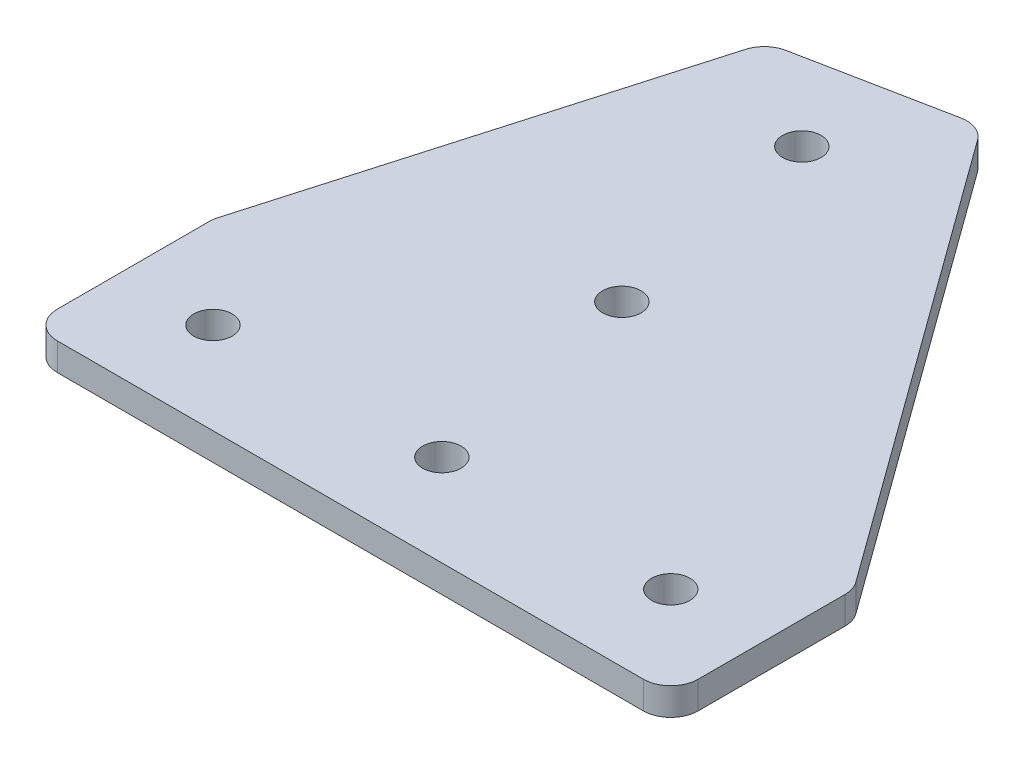
ISO-10303-21;
HEADER;
FILE_DESCRIPTION(('STEP AP214'),'2;1');
FILE_NAME('part.step','',(''),(''),'','','');
FILE_SCHEMA(('AUTOMOTIVE_DESIGN { 1 0 10303 214 1 1 1 1 }'));
ENDSEC;
DATA;
#1=APPLICATION_CONTEXT('core data for automotive mechanical design processes');
#2=APPLICATION_PROTOCOL_DEFINITION('international standard','automotive_design',2000,#1);
#3=PRODUCT_CONTEXT('',#1,'mechanical');
#4=PRODUCT('Part','Part','',(#3));
#5=PRODUCT_RELATED_PRODUCT_CATEGORY('part','',(#4));
#6=PRODUCT_DEFINITION_FORMATION('','',#4);
#7=PRODUCT_DEFINITION_CONTEXT('part definition',#1,'design');
#8=PRODUCT_DEFINITION('design','',#6,#7);
#9=PRODUCT_DEFINITION_SHAPE('','',#8);
#10=(LENGTH_UNIT() NAMED_UNIT(*) SI_UNIT(.MILLI.,.METRE.));
#11=(NAMED_UNIT(*) PLANE_ANGLE_UNIT() SI_UNIT($,.RADIAN.));
#12=(NAMED_UNIT(*) SI_UNIT($,.STERADIAN.) SOLID_ANGLE_UNIT());
#13=UNCERTAINTY_MEASURE_WITH_UNIT(LENGTH_MEASURE(1.E-05),#10,'distance_accuracy_value','');
#14=(GEOMETRIC_REPRESENTATION_CONTEXT(3) GLOBAL_UNCERTAINTY_ASSIGNED_CONTEXT((#13)) GLOBAL_UNIT_ASSIGNED_CONTEXT((#10,
#11,#12)) REPRESENTATION_CONTEXT('',''));
#15=CARTESIAN_POINT('',(0.,0.,0.));
#16=DIRECTION('',(0.,0.,1.));
#17=DIRECTION('',(1.,0.,0.));
#18=AXIS2_PLACEMENT_3D('',#15,#16,#17);
#19=CARTESIAN_POINT('',(-11.6746054395056,3.,-58.8532377005026));
#20=DIRECTION('',(0.194576757325094,0.,0.980887295008377));
#21=DIRECTION('',(0.980887295008377,0.,-0.194576757325094));
#22=AXIS2_PLACEMENT_3D('',#19,#20,#21);
#23=PLANE('',#22);
#24=DIRECTION('',(-0.980887295008377,0.,0.194576757325094));
#25=VECTOR('',#24,1.);
#26=CARTESIAN_POINT('',(-11.6746054395056,3.,-58.8532377005026));
#27=LINE('',#26,#25);
#28=CARTESIAN_POINT('',(-3.74948719123686,3.,-60.4253284167484));
#29=VERTEX_POINT('',#28);
#30=CARTESIAN_POINT('',(-19.6905986844829,3.,-57.2631202830533));
#31=VERTEX_POINT('',#30);
#32=EDGE_CURVE('E150',#29,#31,#27,.T.);
#33=ORIENTED_EDGE('',*,*,#32,.F.);
#34=DIRECTION('',(0.,-1.,0.));
#35=VECTOR('',#34,1.);
#36=CARTESIAN_POINT('',(-3.74948719123686,0.,-60.4253284167484));
#37=LINE('',#36,#35);
#38=CARTESIAN_POINT('',(-3.74948719123686,0.,-60.4253284167484));
#39=VERTEX_POINT('',#38);
#40=EDGE_CURVE('E135',#29,#39,#37,.T.);
#41=ORIENTED_EDGE('',*,*,#40,.T.);
#42=DIRECTION('',(-0.980887295008377,0.,0.194576757325094));
#43=VECTOR('',#42,1.);
#44=CARTESIAN_POINT('',(-11.6746054395056,0.,-58.8532377005026));
#45=LINE('',#44,#43);
#46=CARTESIAN_POINT('',(-19.6905986844829,0.,-57.2631202830533));
#47=VERTEX_POINT('',#46);
#48=EDGE_CURVE('E147',#39,#47,#45,.T.);
#49=ORIENTED_EDGE('',*,*,#48,.T.);
#50=DIRECTION('',(0.,-1.,0.));
#51=VECTOR('',#50,1.);
#52=CARTESIAN_POINT('',(-19.6905986844829,3.,-57.2631202830533));
#53=LINE('',#52,#51);
#54=EDGE_CURVE('E152',#47,#31,#53,.F.);
#55=ORIENTED_EDGE('',*,*,#54,.T.);
#56=EDGE_LOOP('',(#33,#41,#49,#55));
#57=FACE_BOUND('',#56,.T.);
#58=ADVANCED_FACE('F41',(#57),#23,.F.);
#59=CARTESIAN_POINT('',(-34.9772916586416,3.,-10.0788065801698));
#60=DIRECTION('',(0.960902540461166,0.,0.276886813942587));
#61=DIRECTION('',(0.276886813942587,0.,-0.960902540461166));
#62=AXIS2_PLACEMENT_3D('',#59,#60,#61);
#63=PLANE('',#62);
#64=DIRECTION('',(-0.276886813942587,0.,0.960902540461166));
#65=VECTOR('',#64,1.);
#66=CARTESIAN_POINT('',(-34.9772916586416,0.,-10.0788065801698));
#67=LINE('',#66,#65);
#68=CARTESIAN_POINT('',(-21.9895760338912,0.,-55.151118839856));
#69=VERTEX_POINT('',#68);
#70=CARTESIAN_POINT('',(-34.8827076213835,0.,-10.407049158407));
#71=VERTEX_POINT('',#70);
#72=EDGE_CURVE('E158',#69,#71,#67,.T.);
#73=ORIENTED_EDGE('',*,*,#72,.T.);
#74=DIRECTION('',(0.,-1.,0.));
#75=VECTOR('',#74,1.);
#76=CARTESIAN_POINT('',(-34.8827076213835,3.,-10.407049158407));
#77=LINE('',#76,#75);
#78=CARTESIAN_POINT('',(-34.8827076213835,3.,-10.407049158407));
#79=VERTEX_POINT('',#78);
#80=EDGE_CURVE('E11',#71,#79,#77,.F.);
#81=ORIENTED_EDGE('',*,*,#80,.T.);
#82=DIRECTION('',(-0.276886813942587,0.,0.960902540461166));
#83=VECTOR('',#82,1.);
#84=CARTESIAN_POINT('',(-34.9772916586416,3.,-10.0788065801698));
#85=LINE('',#84,#83);
#86=CARTESIAN_POINT('',(-21.9895760338912,3.,-55.151118839856));
#87=VERTEX_POINT('',#86);
#88=EDGE_CURVE('E234',#87,#79,#85,.T.);
#89=ORIENTED_EDGE('',*,*,#88,.F.);
#90=DIRECTION('',(0.,-1.,0.));
#91=VECTOR('',#90,1.);
#92=CARTESIAN_POINT('',(-21.9895760338912,3.,-55.151118839856));
#93=LINE('',#92,#91);
#94=EDGE_CURVE('E49',#87,#69,#93,.T.);
#95=ORIENTED_EDGE('',*,*,#94,.T.);
#96=EDGE_LOOP('',(#73,#81,#89,#95));
#97=FACE_BOUND('',#96,.T.);
#98=ADVANCED_FACE('F231',(#97),#63,.F.);
#99=CARTESIAN_POINT('',(-35.,3.,0.));
#100=DIRECTION('',(1.,0.,0.));
#101=DIRECTION('',(0.,0.,-1.));
#102=AXIS2_PLACEMENT_3D('',#99,#100,#101);
#103=PLANE('',#102);
#104=DIRECTION('',(0.,0.,1.));
#105=VECTOR('',#104,1.);
#106=CARTESIAN_POINT('',(-35.,0.,0.));
#107=LINE('',#106,#105);
#108=CARTESIAN_POINT('',(-35.,0.,-9.57638871657927));
#109=VERTEX_POINT('',#108);
#110=CARTESIAN_POINT('',(-35.,0.,7.));
#111=VERTEX_POINT('',#110);
#112=EDGE_CURVE('E161',#109,#111,#107,.T.);
#113=ORIENTED_EDGE('',*,*,#112,.T.);
#114=DIRECTION('',(0.,-1.,0.));
#115=VECTOR('',#114,1.);
#116=CARTESIAN_POINT('',(-35.,3.,7.));
#117=LINE('',#116,#115);
#118=CARTESIAN_POINT('',(-35.,3.,7.));
#119=VERTEX_POINT('',#118);
#120=EDGE_CURVE('E226',#111,#119,#117,.F.);
#121=ORIENTED_EDGE('',*,*,#120,.T.);
#122=DIRECTION('',(0.,0.,1.));
#123=VECTOR('',#122,1.);
#124=CARTESIAN_POINT('',(-35.,3.,0.));
#125=LINE('',#124,#123);
#126=CARTESIAN_POINT('',(-35.,3.,-9.57638871657927));
#127=VERTEX_POINT('',#126);
#128=EDGE_CURVE('E247',#127,#119,#125,.T.);
#129=ORIENTED_EDGE('',*,*,#128,.F.);
#130=DIRECTION('',(0.,-1.,0.));
#131=VECTOR('',#130,1.);
#132=CARTESIAN_POINT('',(-35.,3.,-9.57638871657927));
#133=LINE('',#132,#131);
#134=EDGE_CURVE('E223',#127,#109,#133,.T.);
#135=ORIENTED_EDGE('',*,*,#134,.T.);
#136=EDGE_LOOP('',(#113,#121,#129,#135));
#137=FACE_BOUND('',#136,.T.);
#138=ADVANCED_FACE('F244',(#137),#103,.F.);
#139=CARTESIAN_POINT('',(0.,3.,10.));
#140=DIRECTION('',(0.,0.,-1.));
#141=DIRECTION('',(-1.,0.,0.));
#142=AXIS2_PLACEMENT_3D('',#139,#140,#141);
#143=PLANE('',#142);
#144=DIRECTION('',(1.,0.,0.));
#145=VECTOR('',#144,1.);
#146=CARTESIAN_POINT('',(0.,3.,10.));
#147=LINE('',#146,#145);
#148=CARTESIAN_POINT('',(-32.,3.,10.));
#149=VERTEX_POINT('',#148);
#150=CARTESIAN_POINT('',(32.,3.,10.));
#151=VERTEX_POINT('',#150);
#152=EDGE_CURVE('E249',#149,#151,#147,.T.);
#153=ORIENTED_EDGE('',*,*,#152,.F.);
#154=DIRECTION('',(0.,-1.,0.));
#155=VECTOR('',#154,1.);
#156=CARTESIAN_POINT('',(-32.,3.,10.));
#157=LINE('',#156,#155);
#158=CARTESIAN_POINT('',(-32.,0.,10.));
#159=VERTEX_POINT('',#158);
#160=EDGE_CURVE('E220',#149,#159,#157,.T.);
#161=ORIENTED_EDGE('',*,*,#160,.T.);
#162=DIRECTION('',(1.,0.,0.));
#163=VECTOR('',#162,1.);
#164=CARTESIAN_POINT('',(0.,0.,10.));
#165=LINE('',#164,#163);
#166=CARTESIAN_POINT('',(32.,0.,10.));
#167=VERTEX_POINT('',#166);
#168=EDGE_CURVE('E169',#159,#167,#165,.T.);
#169=ORIENTED_EDGE('',*,*,#168,.T.);
#170=DIRECTION('',(0.,-1.,0.));
#171=VECTOR('',#170,1.);
#172=CARTESIAN_POINT('',(32.,3.,10.));
#173=LINE('',#172,#171);
#174=EDGE_CURVE('E218',#167,#151,#173,.F.);
#175=ORIENTED_EDGE('',*,*,#174,.T.);
#176=EDGE_LOOP('',(#153,#161,#169,#175));
#177=FACE_BOUND('',#176,.T.);
#178=ADVANCED_FACE('F325',(#177),#143,.F.);
#179=CARTESIAN_POINT('',(35.,3.,0.));
#180=DIRECTION('',(1.,0.,0.));
#181=DIRECTION('',(0.,0.,-1.));
#182=AXIS2_PLACEMENT_3D('',#179,#180,#181);
#183=PLANE('',#182);
#184=DIRECTION('',(0.,0.,1.));
#185=VECTOR('',#184,1.);
#186=CARTESIAN_POINT('',(35.,0.,0.));
#187=LINE('',#186,#185);
#188=CARTESIAN_POINT('',(35.,0.,-9.02613656287791));
#189=VERTEX_POINT('',#188);
#190=CARTESIAN_POINT('',(35.,0.,7.));
#191=VERTEX_POINT('',#190);
#192=EDGE_CURVE('E172',#189,#191,#187,.T.);
#193=ORIENTED_EDGE('',*,*,#192,.F.);
#194=DIRECTION('',(0.,-1.,0.));
#195=VECTOR('',#194,1.);
#196=CARTESIAN_POINT('',(35.,3.,-9.02613656287791));
#197=LINE('',#196,#195);
#198=CARTESIAN_POINT('',(35.,3.,-9.02613656287791));
#199=VERTEX_POINT('',#198);
#200=EDGE_CURVE('E63',#189,#199,#197,.F.);
#201=ORIENTED_EDGE('',*,*,#200,.T.);
#202=DIRECTION('',(0.,0.,1.));
#203=VECTOR('',#202,1.);
#204=CARTESIAN_POINT('',(35.,3.,0.));
#205=LINE('',#204,#203);
#206=CARTESIAN_POINT('',(35.,3.,7.));
#207=VERTEX_POINT('',#206);
#208=EDGE_CURVE('E251',#199,#207,#205,.T.);
#209=ORIENTED_EDGE('',*,*,#208,.T.);
#210=DIRECTION('',(0.,-1.,0.));
#211=VECTOR('',#210,1.);
#212=CARTESIAN_POINT('',(35.,0.,7.));
#213=LINE('',#212,#211);
#214=EDGE_CURVE('E214',#207,#191,#213,.T.);
#215=ORIENTED_EDGE('',*,*,#214,.T.);
#216=EDGE_LOOP('',(#193,#201,#209,#215));
#217=FACE_BOUND('',#216,.T.);
#218=ADVANCED_FACE('F319',(#217),#183,.T.);
#219=CARTESIAN_POINT('',(-9.7288378662547,3.,-49.0443647504189));
#220=DIRECTION('',(0.,-1.,0.));
#221=DIRECTION('',(0.,0.,-1.));
#222=AXIS2_PLACEMENT_3D('',#219,#220,#221);
#223=CYLINDRICAL_SURFACE('',#222,2.1);
#224=CARTESIAN_POINT('',(-9.7288378662547,3.,-49.0443647504189));
#225=DIRECTION('',(0.,1.,0.));
#226=DIRECTION('',(0.,0.,1.));
#227=AXIS2_PLACEMENT_3D('',#224,#225,#226);
#228=CIRCLE('',#227,2.1);
#229=CARTESIAN_POINT('',(-9.7288378662547,3.,-46.9443647504189));
#230=VERTEX_POINT('',#229);
#231=EDGE_CURVE('E268',#230,#230,#228,.T.);
#232=ORIENTED_EDGE('',*,*,#231,.T.);
#233=EDGE_LOOP('',(#232));
#234=FACE_BOUND('',#233,.T.);
#235=CARTESIAN_POINT('',(-9.7288378662547,0.,-49.0443647504189));
#236=DIRECTION('',(0.,1.,0.));
#237=DIRECTION('',(0.,0.,1.));
#238=AXIS2_PLACEMENT_3D('',#235,#236,#237);
#239=CIRCLE('',#238,2.1);
#240=CARTESIAN_POINT('',(-9.7288378662547,0.,-46.9443647504189));
#241=VERTEX_POINT('',#240);
#242=EDGE_CURVE('E186',#241,#241,#239,.T.);
#243=ORIENTED_EDGE('',*,*,#242,.F.);
#244=EDGE_LOOP('',(#243));
#245=FACE_BOUND('',#244,.T.);
#246=ADVANCED_FACE('F333',(#234,#245),#223,.F.);
#247=CARTESIAN_POINT('',(0.,3.,0.));
#248=DIRECTION('',(0.,-1.,0.));
#249=DIRECTION('',(0.,0.,-1.));
#250=AXIS2_PLACEMENT_3D('',#247,#248,#249);
#251=CYLINDRICAL_SURFACE('',#250,2.1);
#252=CARTESIAN_POINT('',(0.,3.,0.));
#253=DIRECTION('',(0.,1.,0.));
#254=DIRECTION('',(0.,0.,1.));
#255=AXIS2_PLACEMENT_3D('',#252,#253,#254);
#256=CIRCLE('',#255,2.1);
#257=CARTESIAN_POINT('',(0.,3.,2.1));
#258=VERTEX_POINT('',#257);
#259=EDGE_CURVE('E266',#258,#258,#256,.T.);
#260=ORIENTED_EDGE('',*,*,#259,.T.);
#261=EDGE_LOOP('',(#260));
#262=FACE_BOUND('',#261,.T.);
#263=CARTESIAN_POINT('',(0.,0.,0.));
#264=DIRECTION('',(0.,1.,0.));
#265=DIRECTION('',(0.,0.,1.));
#266=AXIS2_PLACEMENT_3D('',#263,#264,#265);
#267=CIRCLE('',#266,2.1);
#268=CARTESIAN_POINT('',(0.,0.,2.1));
#269=VERTEX_POINT('',#268);
#270=EDGE_CURVE('E183',#269,#269,#267,.T.);
#271=ORIENTED_EDGE('',*,*,#270,.F.);
#272=EDGE_LOOP('',(#271));
#273=FACE_BOUND('',#272,.T.);
#274=ADVANCED_FACE('F344',(#262,#273),#251,.F.);
#275=CARTESIAN_POINT('',(25.,3.,0.));
#276=DIRECTION('',(0.,-1.,0.));
#277=DIRECTION('',(0.,0.,-1.));
#278=AXIS2_PLACEMENT_3D('',#275,#276,#277);
#279=CYLINDRICAL_SURFACE('',#278,2.1);
#280=CARTESIAN_POINT('',(25.,3.,0.));
#281=DIRECTION('',(0.,1.,0.));
#282=DIRECTION('',(0.,0.,1.));
#283=AXIS2_PLACEMENT_3D('',#280,#281,#282);
#284=CIRCLE('',#283,2.1);
#285=CARTESIAN_POINT('',(25.,3.,2.1));
#286=VERTEX_POINT('',#285);
#287=EDGE_CURVE('E263',#286,#286,#284,.T.);
#288=ORIENTED_EDGE('',*,*,#287,.T.);
#289=EDGE_LOOP('',(#288));
#290=FACE_BOUND('',#289,.T.);
#291=CARTESIAN_POINT('',(25.,0.,0.));
#292=DIRECTION('',(0.,1.,0.));
#293=DIRECTION('',(0.,0.,1.));
#294=AXIS2_PLACEMENT_3D('',#291,#292,#293);
#295=CIRCLE('',#294,2.1);
#296=CARTESIAN_POINT('',(25.,0.,2.1));
#297=VERTEX_POINT('',#296);
#298=EDGE_CURVE('E180',#297,#297,#295,.T.);
#299=ORIENTED_EDGE('',*,*,#298,.F.);
#300=EDGE_LOOP('',(#299));
#301=FACE_BOUND('',#300,.T.);
#302=ADVANCED_FACE('F340',(#290,#301),#279,.F.);
#303=CARTESIAN_POINT('',(-25.,3.,0.));
#304=DIRECTION('',(0.,-1.,0.));
#305=DIRECTION('',(0.,0.,-1.));
#306=AXIS2_PLACEMENT_3D('',#303,#304,#305);
#307=CYLINDRICAL_SURFACE('',#306,2.1);
#308=CARTESIAN_POINT('',(-25.,3.,0.));
#309=DIRECTION('',(0.,1.,0.));
#310=DIRECTION('',(0.,0.,1.));
#311=AXIS2_PLACEMENT_3D('',#308,#309,#310);
#312=CIRCLE('',#311,2.1);
#313=CARTESIAN_POINT('',(-25.,3.,2.1));
#314=VERTEX_POINT('',#313);
#315=EDGE_CURVE('E260',#314,#314,#312,.T.);
#316=ORIENTED_EDGE('',*,*,#315,.T.);
#317=EDGE_LOOP('',(#316));
#318=FACE_BOUND('',#317,.T.);
#319=CARTESIAN_POINT('',(-25.,0.,0.));
#320=DIRECTION('',(0.,1.,0.));
#321=DIRECTION('',(0.,0.,1.));
#322=AXIS2_PLACEMENT_3D('',#319,#320,#321);
#323=CIRCLE('',#322,2.1);
#324=CARTESIAN_POINT('',(-25.,0.,2.1));
#325=VERTEX_POINT('',#324);
#326=EDGE_CURVE('E177',#325,#325,#323,.T.);
#327=ORIENTED_EDGE('',*,*,#326,.F.);
#328=EDGE_LOOP('',(#327));
#329=FACE_BOUND('',#328,.T.);
#330=ADVANCED_FACE('F337',(#318,#329),#307,.F.);
#331=CARTESIAN_POINT('',(27.6793842625367,3.,-20.0874164798225));
#332=DIRECTION('',(0.80933435700385,0.,-0.587348191938278));
#333=DIRECTION('',(-0.587348191938278,0.,-0.80933435700385));
#334=AXIS2_PLACEMENT_3D('',#331,#332,#333);
#335=PLANE('',#334);
#336=DIRECTION('',(0.587348191938278,0.,0.80933435700385));
#337=VECTOR('',#336,1.);
#338=CARTESIAN_POINT('',(27.6793842625367,0.,-20.0874164798225));
#339=LINE('',#338,#337);
#340=CARTESIAN_POINT('',(-0.73775384825003,0.,-59.2447111075381));
#341=VERTEX_POINT('',#340);
#342=CARTESIAN_POINT('',(34.4280030710116,0.,-10.7881811386927));
#343=VERTEX_POINT('',#342);
#344=EDGE_CURVE('E175',#341,#343,#339,.T.);
#345=ORIENTED_EDGE('',*,*,#344,.F.);
#346=DIRECTION('',(0.,-1.,0.));
#347=VECTOR('',#346,1.);
#348=CARTESIAN_POINT('',(-0.737753848250034,3.,-59.2447111075381));
#349=LINE('',#348,#347);
#350=CARTESIAN_POINT('',(-0.73775384825003,3.,-59.2447111075381));
#351=VERTEX_POINT('',#350);
#352=EDGE_CURVE('E136',#341,#351,#349,.F.);
#353=ORIENTED_EDGE('',*,*,#352,.T.);
#354=DIRECTION('',(0.587348191938278,0.,0.80933435700385));
#355=VECTOR('',#354,1.);
#356=CARTESIAN_POINT('',(27.6793842625367,3.,-20.0874164798225));
#357=LINE('',#356,#355);
#358=CARTESIAN_POINT('',(34.4280030710116,3.,-10.7881811386927));
#359=VERTEX_POINT('',#358);
#360=EDGE_CURVE('E257',#351,#359,#357,.T.);
#361=ORIENTED_EDGE('',*,*,#360,.T.);
#362=DIRECTION('',(0.,-1.,0.));
#363=VECTOR('',#362,1.);
#364=CARTESIAN_POINT('',(34.4280030710116,3.,-10.7881811386927));
#365=LINE('',#364,#363);
#366=EDGE_CURVE('E141',#359,#343,#365,.T.);
#367=ORIENTED_EDGE('',*,*,#366,.T.);
#368=EDGE_LOOP('',(#345,#353,#361,#367));
#369=FACE_BOUND('',#368,.T.);
#370=ADVANCED_FACE('F287',(#369),#335,.T.);
#371=CARTESIAN_POINT('',(-4.86441893312735,3.,-24.5221823752094));
#372=DIRECTION('',(0.,-1.,0.));
#373=DIRECTION('',(0.,0.,-1.));
#374=AXIS2_PLACEMENT_3D('',#371,#372,#373);
#375=CYLINDRICAL_SURFACE('',#374,2.1);
#376=CARTESIAN_POINT('',(-4.86441893312735,3.,-24.5221823752094));
#377=DIRECTION('',(0.,1.,0.));
#378=DIRECTION('',(0.,0.,1.));
#379=AXIS2_PLACEMENT_3D('',#376,#377,#378);
#380=CIRCLE('',#379,2.1);
#381=CARTESIAN_POINT('',(-4.86441893312735,3.,-22.4221823752094));
#382=VERTEX_POINT('',#381);
#383=EDGE_CURVE('E164',#382,#382,#380,.T.);
#384=ORIENTED_EDGE('',*,*,#383,.T.);
#385=EDGE_LOOP('',(#384));
#386=FACE_BOUND('',#385,.T.);
#387=CARTESIAN_POINT('',(-4.86441893312735,0.,-24.5221823752094));
#388=DIRECTION('',(0.,1.,0.));
#389=DIRECTION('',(0.,0.,1.));
#390=AXIS2_PLACEMENT_3D('',#387,#388,#389);
#391=CIRCLE('',#390,2.1);
#392=CARTESIAN_POINT('',(-4.86441893312735,0.,-22.4221823752094));
#393=VERTEX_POINT('',#392);
#394=EDGE_CURVE('E189',#393,#393,#391,.T.);
#395=ORIENTED_EDGE('',*,*,#394,.F.);
#396=EDGE_LOOP('',(#395));
#397=FACE_BOUND('',#396,.T.);
#398=ADVANCED_FACE('F275',(#386,#397),#375,.F.);
#399=CARTESIAN_POINT('',(0.,3.,0.));
#400=DIRECTION('',(0.,1.,0.));
#401=DIRECTION('',(0.,0.,1.));
#402=AXIS2_PLACEMENT_3D('',#399,#400,#401);
#403=PLANE('',#402);
#404=ORIENTED_EDGE('',*,*,#360,.F.);
#405=CARTESIAN_POINT('',(-3.16575691926158,3.,-57.4826665317232));
#406=DIRECTION('',(0.,1.,0.));
#407=DIRECTION('',(0.,0.,1.));
#408=AXIS2_PLACEMENT_3D('',#405,#406,#407);
#409=CIRCLE('',#408,3.);
#410=EDGE_CURVE('E212',#351,#29,#409,.T.);
#411=ORIENTED_EDGE('',*,*,#410,.T.);
#412=ORIENTED_EDGE('',*,*,#32,.T.);
#413=CARTESIAN_POINT('',(-19.1068684125077,3.,-54.3204583980282));
#414=DIRECTION('',(0.,1.,0.));
#415=DIRECTION('',(0.,0.,1.));
#416=AXIS2_PLACEMENT_3D('',#413,#414,#415);
#417=CIRCLE('',#416,3.);
#418=EDGE_CURVE('E204',#31,#87,#417,.T.);
#419=ORIENTED_EDGE('',*,*,#418,.T.);
#420=ORIENTED_EDGE('',*,*,#88,.T.);
#421=CARTESIAN_POINT('',(-32.,3.,-9.57638871657927));
#422=DIRECTION('',(0.,1.,0.));
#423=DIRECTION('',(0.,0.,1.));
#424=AXIS2_PLACEMENT_3D('',#421,#422,#423);
#425=CIRCLE('',#424,3.);
#426=EDGE_CURVE('E206',#79,#127,#425,.T.);
#427=ORIENTED_EDGE('',*,*,#426,.T.);
#428=ORIENTED_EDGE('',*,*,#128,.T.);
#429=CARTESIAN_POINT('',(-32.,3.,7.));
#430=DIRECTION('',(0.,1.,0.));
#431=DIRECTION('',(0.,0.,1.));
#432=AXIS2_PLACEMENT_3D('',#429,#430,#431);
#433=CIRCLE('',#432,3.);
#434=EDGE_CURVE('E208',#119,#149,#433,.T.);
#435=ORIENTED_EDGE('',*,*,#434,.T.);
#436=ORIENTED_EDGE('',*,*,#152,.T.);
#437=CARTESIAN_POINT('',(32.,3.,7.));
#438=DIRECTION('',(0.,1.,0.));
#439=DIRECTION('',(0.,0.,1.));
#440=AXIS2_PLACEMENT_3D('',#437,#438,#439);
#441=CIRCLE('',#440,3.);
#442=EDGE_CURVE('E56',#151,#207,#441,.T.);
#443=ORIENTED_EDGE('',*,*,#442,.T.);
#444=ORIENTED_EDGE('',*,*,#208,.F.);
#445=CARTESIAN_POINT('',(32.,3.,-9.02613656287791));
#446=DIRECTION('',(0.,1.,0.));
#447=DIRECTION('',(0.,0.,1.));
#448=AXIS2_PLACEMENT_3D('',#445,#446,#447);
#449=CIRCLE('',#448,3.);
#450=EDGE_CURVE('E210',#199,#359,#449,.T.);
#451=ORIENTED_EDGE('',*,*,#450,.T.);
#452=EDGE_LOOP('',(#404,#411,#412,#419,#420,#427,#428,#435,#436,#443,#444,#451));
#453=FACE_BOUND('',#452,.T.);
#454=ORIENTED_EDGE('',*,*,#315,.F.);
#455=EDGE_LOOP('',(#454));
#456=FACE_BOUND('',#455,.T.);
#457=ORIENTED_EDGE('',*,*,#287,.F.);
#458=EDGE_LOOP('',(#457));
#459=FACE_BOUND('',#458,.T.);
#460=ORIENTED_EDGE('',*,*,#259,.F.);
#461=EDGE_LOOP('',(#460));
#462=FACE_BOUND('',#461,.T.);
#463=ORIENTED_EDGE('',*,*,#231,.F.);
#464=EDGE_LOOP('',(#463));
#465=FACE_BOUND('',#464,.T.);
#466=ORIENTED_EDGE('',*,*,#383,.F.);
#467=EDGE_LOOP('',(#466));
#468=FACE_BOUND('',#467,.T.);
#469=ADVANCED_FACE('F278',(#453,#456,#459,#462,#465,#468),#403,.T.);
#470=CARTESIAN_POINT('',(0.,0.,0.));
#471=DIRECTION('',(0.,1.,0.));
#472=DIRECTION('',(0.,0.,1.));
#473=AXIS2_PLACEMENT_3D('',#470,#471,#472);
#474=PLANE('',#473);
#475=ORIENTED_EDGE('',*,*,#48,.F.);
#476=CARTESIAN_POINT('',(-3.16575691926158,0.,-57.4826665317232));
#477=DIRECTION('',(0.,1.,0.));
#478=DIRECTION('',(0.,0.,1.));
#479=AXIS2_PLACEMENT_3D('',#476,#477,#478);
#480=CIRCLE('',#479,3.);
#481=EDGE_CURVE('E131',#39,#341,#480,.F.);
#482=ORIENTED_EDGE('',*,*,#481,.T.);
#483=ORIENTED_EDGE('',*,*,#344,.T.);
#484=CARTESIAN_POINT('',(32.,0.,-9.02613656287791));
#485=DIRECTION('',(0.,1.,0.));
#486=DIRECTION('',(0.,0.,1.));
#487=AXIS2_PLACEMENT_3D('',#484,#485,#486);
#488=CIRCLE('',#487,3.);
#489=EDGE_CURVE('E142',#343,#189,#488,.F.);
#490=ORIENTED_EDGE('',*,*,#489,.T.);
#491=ORIENTED_EDGE('',*,*,#192,.T.);
#492=CARTESIAN_POINT('',(32.,0.,7.));
#493=DIRECTION('',(0.,1.,0.));
#494=DIRECTION('',(0.,0.,1.));
#495=AXIS2_PLACEMENT_3D('',#492,#493,#494);
#496=CIRCLE('',#495,3.);
#497=EDGE_CURVE('E151',#191,#167,#496,.F.);
#498=ORIENTED_EDGE('',*,*,#497,.T.);
#499=ORIENTED_EDGE('',*,*,#168,.F.);
#500=CARTESIAN_POINT('',(-32.,0.,7.));
#501=DIRECTION('',(0.,1.,0.));
#502=DIRECTION('',(0.,0.,1.));
#503=AXIS2_PLACEMENT_3D('',#500,#501,#502);
#504=CIRCLE('',#503,3.);
#505=EDGE_CURVE('E197',#159,#111,#504,.F.);
#506=ORIENTED_EDGE('',*,*,#505,.T.);
#507=ORIENTED_EDGE('',*,*,#112,.F.);
#508=CARTESIAN_POINT('',(-32.,0.,-9.57638871657927));
#509=DIRECTION('',(0.,1.,0.));
#510=DIRECTION('',(0.,0.,1.));
#511=AXIS2_PLACEMENT_3D('',#508,#509,#510);
#512=CIRCLE('',#511,3.);
#513=EDGE_CURVE('E195',#109,#71,#512,.F.);
#514=ORIENTED_EDGE('',*,*,#513,.T.);
#515=ORIENTED_EDGE('',*,*,#72,.F.);
#516=CARTESIAN_POINT('',(-19.1068684125077,0.,-54.3204583980282));
#517=DIRECTION('',(0.,1.,0.));
#518=DIRECTION('',(0.,0.,1.));
#519=AXIS2_PLACEMENT_3D('',#516,#517,#518);
#520=CIRCLE('',#519,3.);
#521=EDGE_CURVE('E157',#69,#47,#520,.F.);
#522=ORIENTED_EDGE('',*,*,#521,.T.);
#523=EDGE_LOOP('',(#475,#482,#483,#490,#491,#498,#499,#506,#507,#514,#515,#522));
#524=FACE_BOUND('',#523,.T.);
#525=ORIENTED_EDGE('',*,*,#326,.T.);
#526=EDGE_LOOP('',(#525));
#527=FACE_BOUND('',#526,.T.);
#528=ORIENTED_EDGE('',*,*,#298,.T.);
#529=EDGE_LOOP('',(#528));
#530=FACE_BOUND('',#529,.T.);
#531=ORIENTED_EDGE('',*,*,#270,.T.);
#532=EDGE_LOOP('',(#531));
#533=FACE_BOUND('',#532,.T.);
#534=ORIENTED_EDGE('',*,*,#242,.T.);
#535=EDGE_LOOP('',(#534));
#536=FACE_BOUND('',#535,.T.);
#537=ORIENTED_EDGE('',*,*,#394,.T.);
#538=EDGE_LOOP('',(#537));
#539=FACE_BOUND('',#538,.T.);
#540=ADVANCED_FACE('F154',(#524,#527,#530,#533,#536,#539),#474,.F.);
#541=CARTESIAN_POINT('',(-3.16575691926158,3.,-57.4826665317232));
#542=DIRECTION('',(0.,1.,0.));
#543=DIRECTION('',(0.,0.,1.));
#544=AXIS2_PLACEMENT_3D('',#541,#542,#543);
#545=CYLINDRICAL_SURFACE('',#544,3.);
#546=ORIENTED_EDGE('',*,*,#410,.F.);
#547=ORIENTED_EDGE('',*,*,#352,.F.);
#548=ORIENTED_EDGE('',*,*,#481,.F.);
#549=ORIENTED_EDGE('',*,*,#40,.F.);
#550=EDGE_LOOP('',(#546,#547,#548,#549));
#551=FACE_BOUND('',#550,.T.);
#552=ADVANCED_FACE('F134',(#551),#545,.T.);
#553=CARTESIAN_POINT('',(32.,3.,-9.02613656287791));
#554=DIRECTION('',(0.,-1.,0.));
#555=DIRECTION('',(0.,0.,-1.));
#556=AXIS2_PLACEMENT_3D('',#553,#554,#555);
#557=CYLINDRICAL_SURFACE('',#556,3.);
#558=ORIENTED_EDGE('',*,*,#450,.F.);
#559=ORIENTED_EDGE('',*,*,#200,.F.);
#560=ORIENTED_EDGE('',*,*,#489,.F.);
#561=ORIENTED_EDGE('',*,*,#366,.F.);
#562=EDGE_LOOP('',(#558,#559,#560,#561));
#563=FACE_BOUND('',#562,.T.);
#564=ADVANCED_FACE('F301',(#563),#557,.T.);
#565=CARTESIAN_POINT('',(-32.,3.,7.));
#566=DIRECTION('',(0.,-1.,0.));
#567=DIRECTION('',(0.,0.,-1.));
#568=AXIS2_PLACEMENT_3D('',#565,#566,#567);
#569=CYLINDRICAL_SURFACE('',#568,3.);
#570=ORIENTED_EDGE('',*,*,#434,.F.);
#571=ORIENTED_EDGE('',*,*,#120,.F.);
#572=ORIENTED_EDGE('',*,*,#505,.F.);
#573=ORIENTED_EDGE('',*,*,#160,.F.);
#574=EDGE_LOOP('',(#570,#571,#572,#573));
#575=FACE_BOUND('',#574,.T.);
#576=ADVANCED_FACE('F304',(#575),#569,.T.);
#577=CARTESIAN_POINT('',(-32.,3.,-9.57638871657927));
#578=DIRECTION('',(0.,-1.,0.));
#579=DIRECTION('',(0.,0.,-1.));
#580=AXIS2_PLACEMENT_3D('',#577,#578,#579);
#581=CYLINDRICAL_SURFACE('',#580,3.);
#582=ORIENTED_EDGE('',*,*,#426,.F.);
#583=ORIENTED_EDGE('',*,*,#80,.F.);
#584=ORIENTED_EDGE('',*,*,#513,.F.);
#585=ORIENTED_EDGE('',*,*,#134,.F.);
#586=EDGE_LOOP('',(#582,#583,#584,#585));
#587=FACE_BOUND('',#586,.T.);
#588=ADVANCED_FACE('F241',(#587),#581,.T.);
#589=CARTESIAN_POINT('',(-19.1068684125077,3.,-54.3204583980282));
#590=DIRECTION('',(0.,-1.,0.));
#591=DIRECTION('',(0.,0.,-1.));
#592=AXIS2_PLACEMENT_3D('',#589,#590,#591);
#593=CYLINDRICAL_SURFACE('',#592,3.);
#594=ORIENTED_EDGE('',*,*,#418,.F.);
#595=ORIENTED_EDGE('',*,*,#54,.F.);
#596=ORIENTED_EDGE('',*,*,#521,.F.);
#597=ORIENTED_EDGE('',*,*,#94,.F.);
#598=EDGE_LOOP('',(#594,#595,#596,#597));
#599=FACE_BOUND('',#598,.T.);
#600=ADVANCED_FACE('F310',(#599),#593,.T.);
#601=CARTESIAN_POINT('',(32.,3.,7.));
#602=DIRECTION('',(0.,1.,0.));
#603=DIRECTION('',(0.,0.,1.));
#604=AXIS2_PLACEMENT_3D('',#601,#602,#603);
#605=CYLINDRICAL_SURFACE('',#604,3.);
#606=ORIENTED_EDGE('',*,*,#442,.F.);
#607=ORIENTED_EDGE('',*,*,#174,.F.);
#608=ORIENTED_EDGE('',*,*,#497,.F.);
#609=ORIENTED_EDGE('',*,*,#214,.F.);
#610=EDGE_LOOP('',(#606,#607,#608,#609));
#611=FACE_BOUND('',#610,.T.);
#612=ADVANCED_FACE('F43',(#611),#605,.T.);
#613=CLOSED_SHELL('',(#58,#98,#138,#178,#218,#246,#274,#302,#330,#370,#398,#469,#540,#552,#564,
#576,#588,#600,#612));
#614=MANIFOLD_SOLID_BREP('B2',#613);
#615=ADVANCED_BREP_SHAPE_REPRESENTATION('',(#18,#614),#14);
#616=SHAPE_DEFINITION_REPRESENTATION(#9,#615);
ENDSEC;
END-ISO-10303-21;
